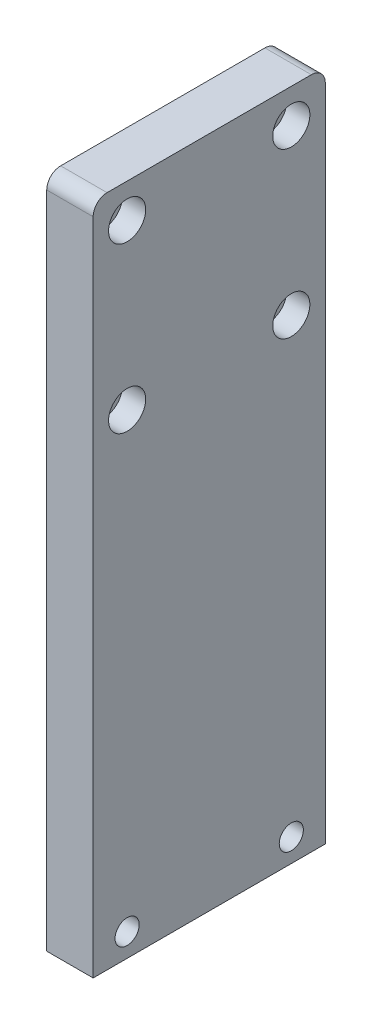
ISO-10303-21;
HEADER;
FILE_DESCRIPTION(('STEP AP214'),'2;1');
FILE_NAME('part.step','',(''),(''),'','','');
FILE_SCHEMA(('AUTOMOTIVE_DESIGN { 1 0 10303 214 1 1 1 1 }'));
ENDSEC;
DATA;
#1=APPLICATION_CONTEXT('core data for automotive mechanical design processes');
#2=APPLICATION_PROTOCOL_DEFINITION('international standard','automotive_design',2000,#1);
#3=PRODUCT_CONTEXT('',#1,'mechanical');
#4=PRODUCT('Part','Part','',(#3));
#5=PRODUCT_RELATED_PRODUCT_CATEGORY('part','',(#4));
#6=PRODUCT_DEFINITION_FORMATION('','',#4);
#7=PRODUCT_DEFINITION_CONTEXT('part definition',#1,'design');
#8=PRODUCT_DEFINITION('design','',#6,#7);
#9=PRODUCT_DEFINITION_SHAPE('','',#8);
#10=(LENGTH_UNIT() NAMED_UNIT(*) SI_UNIT(.MILLI.,.METRE.));
#11=(NAMED_UNIT(*) PLANE_ANGLE_UNIT() SI_UNIT($,.RADIAN.));
#12=(NAMED_UNIT(*) SI_UNIT($,.STERADIAN.) SOLID_ANGLE_UNIT());
#13=UNCERTAINTY_MEASURE_WITH_UNIT(LENGTH_MEASURE(1.E-05),#10,'distance_accuracy_value','');
#14=(GEOMETRIC_REPRESENTATION_CONTEXT(3) GLOBAL_UNCERTAINTY_ASSIGNED_CONTEXT((#13)) GLOBAL_UNIT_ASSIGNED_CONTEXT((#10,
#11,#12)) REPRESENTATION_CONTEXT('',''));
#15=CARTESIAN_POINT('',(0.,0.,0.));
#16=DIRECTION('',(0.,0.,1.));
#17=DIRECTION('',(1.,0.,0.));
#18=AXIS2_PLACEMENT_3D('',#15,#16,#17);
#19=CARTESIAN_POINT('',(10.,-115.,17.68));
#20=DIRECTION('',(-1.,0.,0.));
#21=DIRECTION('',(0.,0.,1.));
#22=AXIS2_PLACEMENT_3D('',#19,#20,#21);
#23=CYLINDRICAL_SURFACE('',#22,2.6);
#24=CARTESIAN_POINT('',(10.,-115.,17.68));
#25=DIRECTION('',(1.,0.,0.));
#26=DIRECTION('',(0.,0.,-1.));
#27=AXIS2_PLACEMENT_3D('',#24,#25,#26);
#28=CIRCLE('',#27,2.6);
#29=CARTESIAN_POINT('',(10.,-115.,15.08));
#30=VERTEX_POINT('',#29);
#31=EDGE_CURVE('E314',#30,#30,#28,.T.);
#32=ORIENTED_EDGE('',*,*,#31,.T.);
#33=EDGE_LOOP('',(#32));
#34=FACE_BOUND('',#33,.T.);
#35=CARTESIAN_POINT('',(5.,-115.,17.68));
#36=DIRECTION('',(-1.,0.,0.));
#37=DIRECTION('',(0.,0.,1.));
#38=AXIS2_PLACEMENT_3D('',#35,#36,#37);
#39=CIRCLE('',#38,2.6);
#40=CARTESIAN_POINT('',(5.,-115.,20.28));
#41=VERTEX_POINT('',#40);
#42=EDGE_CURVE('E51',#41,#41,#39,.T.);
#43=ORIENTED_EDGE('',*,*,#42,.T.);
#44=EDGE_LOOP('',(#43));
#45=FACE_BOUND('',#44,.T.);
#46=ADVANCED_FACE('F47',(#34,#45),#23,.F.);
#47=CARTESIAN_POINT('',(10.,17.68,17.68));
#48=DIRECTION('',(-1.,0.,0.));
#49=DIRECTION('',(0.,0.,1.));
#50=AXIS2_PLACEMENT_3D('',#47,#48,#49);
#51=CYLINDRICAL_SURFACE('',#50,2.6);
#52=CARTESIAN_POINT('',(0.,17.68,17.68));
#53=DIRECTION('',(1.,0.,0.));
#54=DIRECTION('',(0.,0.,-1.));
#55=AXIS2_PLACEMENT_3D('',#52,#53,#54);
#56=CIRCLE('',#55,2.6);
#57=CARTESIAN_POINT('',(0.,17.68,15.08));
#58=VERTEX_POINT('',#57);
#59=EDGE_CURVE('E361',#58,#58,#56,.T.);
#60=ORIENTED_EDGE('',*,*,#59,.F.);
#61=EDGE_LOOP('',(#60));
#62=FACE_BOUND('',#61,.T.);
#63=CARTESIAN_POINT('',(5.,17.68,17.68));
#64=DIRECTION('',(1.,0.,0.));
#65=DIRECTION('',(0.,0.,-1.));
#66=AXIS2_PLACEMENT_3D('',#63,#64,#65);
#67=CIRCLE('',#66,2.6);
#68=CARTESIAN_POINT('',(5.,17.68,15.08));
#69=VERTEX_POINT('',#68);
#70=EDGE_CURVE('E315',#69,#69,#67,.T.);
#71=ORIENTED_EDGE('',*,*,#70,.T.);
#72=EDGE_LOOP('',(#71));
#73=FACE_BOUND('',#72,.T.);
#74=ADVANCED_FACE('F570',(#62,#73),#51,.F.);
#75=CARTESIAN_POINT('',(10.,17.68,-17.68));
#76=DIRECTION('',(-1.,0.,0.));
#77=DIRECTION('',(0.,0.,1.));
#78=AXIS2_PLACEMENT_3D('',#75,#76,#77);
#79=CYLINDRICAL_SURFACE('',#78,2.6);
#80=CARTESIAN_POINT('',(0.,17.68,-17.68));
#81=DIRECTION('',(1.,0.,0.));
#82=DIRECTION('',(0.,0.,1.));
#83=AXIS2_PLACEMENT_3D('',#80,#81,#82);
#84=CIRCLE('',#83,2.6);
#85=CARTESIAN_POINT('',(0.,17.68,-15.08));
#86=VERTEX_POINT('',#85);
#87=EDGE_CURVE('E357',#86,#86,#84,.T.);
#88=ORIENTED_EDGE('',*,*,#87,.F.);
#89=EDGE_LOOP('',(#88));
#90=FACE_BOUND('',#89,.T.);
#91=CARTESIAN_POINT('',(5.,17.68,-17.68));
#92=DIRECTION('',(1.,0.,0.));
#93=DIRECTION('',(0.,0.,-1.));
#94=AXIS2_PLACEMENT_3D('',#91,#92,#93);
#95=CIRCLE('',#94,2.6);
#96=CARTESIAN_POINT('',(5.,17.68,-20.28));
#97=VERTEX_POINT('',#96);
#98=EDGE_CURVE('E377',#97,#97,#95,.T.);
#99=ORIENTED_EDGE('',*,*,#98,.T.);
#100=EDGE_LOOP('',(#99));
#101=FACE_BOUND('',#100,.T.);
#102=ADVANCED_FACE('F576',(#90,#101),#79,.F.);
#103=CARTESIAN_POINT('',(10.,-17.68,-17.68));
#104=DIRECTION('',(-1.,0.,0.));
#105=DIRECTION('',(0.,0.,1.));
#106=AXIS2_PLACEMENT_3D('',#103,#104,#105);
#107=CYLINDRICAL_SURFACE('',#106,2.6);
#108=CARTESIAN_POINT('',(0.,-17.68,-17.68));
#109=DIRECTION('',(1.,0.,0.));
#110=DIRECTION('',(0.,0.,-1.));
#111=AXIS2_PLACEMENT_3D('',#108,#109,#110);
#112=CIRCLE('',#111,2.6);
#113=CARTESIAN_POINT('',(0.,-17.68,-20.28));
#114=VERTEX_POINT('',#113);
#115=EDGE_CURVE('E362',#114,#114,#112,.T.);
#116=ORIENTED_EDGE('',*,*,#115,.F.);
#117=EDGE_LOOP('',(#116));
#118=FACE_BOUND('',#117,.T.);
#119=CARTESIAN_POINT('',(5.,-17.68,-17.68));
#120=DIRECTION('',(1.,0.,0.));
#121=DIRECTION('',(0.,0.,-1.));
#122=AXIS2_PLACEMENT_3D('',#119,#120,#121);
#123=CIRCLE('',#122,2.6);
#124=CARTESIAN_POINT('',(5.,-17.68,-20.28));
#125=VERTEX_POINT('',#124);
#126=EDGE_CURVE('E463',#125,#125,#123,.T.);
#127=ORIENTED_EDGE('',*,*,#126,.T.);
#128=EDGE_LOOP('',(#127));
#129=FACE_BOUND('',#128,.T.);
#130=ADVANCED_FACE('F587',(#118,#129),#107,.F.);
#131=CARTESIAN_POINT('',(10.,-17.68,17.68));
#132=DIRECTION('',(-1.,0.,0.));
#133=DIRECTION('',(0.,0.,1.));
#134=AXIS2_PLACEMENT_3D('',#131,#132,#133);
#135=CYLINDRICAL_SURFACE('',#134,2.6);
#136=CARTESIAN_POINT('',(0.,-17.68,17.68));
#137=DIRECTION('',(1.,0.,0.));
#138=DIRECTION('',(0.,0.,1.));
#139=AXIS2_PLACEMENT_3D('',#136,#137,#138);
#140=CIRCLE('',#139,2.6);
#141=CARTESIAN_POINT('',(0.,-17.68,20.28));
#142=VERTEX_POINT('',#141);
#143=EDGE_CURVE('E322',#142,#142,#140,.T.);
#144=ORIENTED_EDGE('',*,*,#143,.F.);
#145=EDGE_LOOP('',(#144));
#146=FACE_BOUND('',#145,.T.);
#147=CARTESIAN_POINT('',(5.,-17.68,17.68));
#148=DIRECTION('',(1.,0.,0.));
#149=DIRECTION('',(0.,0.,-1.));
#150=AXIS2_PLACEMENT_3D('',#147,#148,#149);
#151=CIRCLE('',#150,2.6);
#152=CARTESIAN_POINT('',(5.,-17.68,15.08));
#153=VERTEX_POINT('',#152);
#154=EDGE_CURVE('E346',#153,#153,#151,.T.);
#155=ORIENTED_EDGE('',*,*,#154,.T.);
#156=EDGE_LOOP('',(#155));
#157=FACE_BOUND('',#156,.T.);
#158=ADVANCED_FACE('F584',(#146,#157),#135,.F.);
#159=CARTESIAN_POINT('',(10.,0.,0.));
#160=DIRECTION('',(1.,0.,0.));
#161=DIRECTION('',(0.,0.,-1.));
#162=AXIS2_PLACEMENT_3D('',#159,#160,#161);
#163=PLANE('',#162);
#164=CARTESIAN_POINT('',(10.,-17.68,-17.68));
#165=DIRECTION('',(1.,0.,0.));
#166=DIRECTION('',(0.,0.,-1.));
#167=AXIS2_PLACEMENT_3D('',#164,#165,#166);
#168=CIRCLE('',#167,4.);
#169=CARTESIAN_POINT('',(10.,-17.68,-21.68));
#170=VERTEX_POINT('',#169);
#171=EDGE_CURVE('E338',#170,#170,#168,.T.);
#172=ORIENTED_EDGE('',*,*,#171,.F.);
#173=EDGE_LOOP('',(#172));
#174=FACE_BOUND('',#173,.T.);
#175=CARTESIAN_POINT('',(10.,-17.68,17.68));
#176=DIRECTION('',(1.,0.,0.));
#177=DIRECTION('',(0.,0.,-1.));
#178=AXIS2_PLACEMENT_3D('',#175,#176,#177);
#179=CIRCLE('',#178,4.);
#180=CARTESIAN_POINT('',(10.,-17.68,13.68));
#181=VERTEX_POINT('',#180);
#182=EDGE_CURVE('E337',#181,#181,#179,.T.);
#183=ORIENTED_EDGE('',*,*,#182,.F.);
#184=EDGE_LOOP('',(#183));
#185=FACE_BOUND('',#184,.T.);
#186=CARTESIAN_POINT('',(10.,17.68,17.68));
#187=DIRECTION('',(1.,0.,0.));
#188=DIRECTION('',(0.,0.,-1.));
#189=AXIS2_PLACEMENT_3D('',#186,#187,#188);
#190=CIRCLE('',#189,4.);
#191=CARTESIAN_POINT('',(10.,17.68,13.68));
#192=VERTEX_POINT('',#191);
#193=EDGE_CURVE('E472',#192,#192,#190,.T.);
#194=ORIENTED_EDGE('',*,*,#193,.F.);
#195=EDGE_LOOP('',(#194));
#196=FACE_BOUND('',#195,.T.);
#197=CARTESIAN_POINT('',(10.,17.68,-17.68));
#198=DIRECTION('',(1.,0.,0.));
#199=DIRECTION('',(0.,0.,-1.));
#200=AXIS2_PLACEMENT_3D('',#197,#198,#199);
#201=CIRCLE('',#200,4.);
#202=CARTESIAN_POINT('',(10.,17.68,-21.68));
#203=VERTEX_POINT('',#202);
#204=EDGE_CURVE('E316',#203,#203,#201,.T.);
#205=ORIENTED_EDGE('',*,*,#204,.F.);
#206=EDGE_LOOP('',(#205));
#207=FACE_BOUND('',#206,.T.);
#208=ORIENTED_EDGE('',*,*,#31,.F.);
#209=EDGE_LOOP('',(#208));
#210=FACE_BOUND('',#209,.T.);
#211=DIRECTION('',(0.,1.,0.));
#212=VECTOR('',#211,1.);
#213=CARTESIAN_POINT('',(10.,-120.,-25.));
#214=LINE('',#213,#212);
#215=CARTESIAN_POINT('',(10.,-120.,-25.));
#216=VERTEX_POINT('',#215);
#217=CARTESIAN_POINT('',(10.,22.,-25.));
#218=VERTEX_POINT('',#217);
#219=EDGE_CURVE('E131',#216,#218,#214,.T.);
#220=ORIENTED_EDGE('',*,*,#219,.T.);
#221=CARTESIAN_POINT('',(10.,22.,-22.));
#222=DIRECTION('',(1.,0.,0.));
#223=DIRECTION('',(0.,0.,-1.));
#224=AXIS2_PLACEMENT_3D('',#221,#222,#223);
#225=CIRCLE('',#224,3.);
#226=CARTESIAN_POINT('',(10.,25.,-22.));
#227=VERTEX_POINT('',#226);
#228=EDGE_CURVE('E57',#218,#227,#225,.T.);
#229=ORIENTED_EDGE('',*,*,#228,.T.);
#230=DIRECTION('',(0.,0.,1.));
#231=VECTOR('',#230,1.);
#232=CARTESIAN_POINT('',(10.,25.,25.));
#233=LINE('',#232,#231);
#234=CARTESIAN_POINT('',(10.,25.,22.));
#235=VERTEX_POINT('',#234);
#236=EDGE_CURVE('E116',#227,#235,#233,.T.);
#237=ORIENTED_EDGE('',*,*,#236,.T.);
#238=CARTESIAN_POINT('',(10.,22.,22.));
#239=DIRECTION('',(1.,0.,0.));
#240=DIRECTION('',(0.,0.,-1.));
#241=AXIS2_PLACEMENT_3D('',#238,#239,#240);
#242=CIRCLE('',#241,3.);
#243=CARTESIAN_POINT('',(10.,22.,25.));
#244=VERTEX_POINT('',#243);
#245=EDGE_CURVE('E65',#235,#244,#242,.T.);
#246=ORIENTED_EDGE('',*,*,#245,.T.);
#247=DIRECTION('',(0.,-1.,0.));
#248=VECTOR('',#247,1.);
#249=CARTESIAN_POINT('',(10.,0.,25.));
#250=LINE('',#249,#248);
#251=CARTESIAN_POINT('',(10.,-120.,25.));
#252=VERTEX_POINT('',#251);
#253=EDGE_CURVE('E106',#244,#252,#250,.T.);
#254=ORIENTED_EDGE('',*,*,#253,.T.);
#255=DIRECTION('',(0.,0.,-1.));
#256=VECTOR('',#255,1.);
#257=CARTESIAN_POINT('',(10.,-120.,25.));
#258=LINE('',#257,#256);
#259=EDGE_CURVE('E111',#252,#216,#258,.T.);
#260=ORIENTED_EDGE('',*,*,#259,.T.);
#261=EDGE_LOOP('',(#220,#229,#237,#246,#254,#260));
#262=FACE_BOUND('',#261,.T.);
#263=CARTESIAN_POINT('',(10.,-115.,-17.68));
#264=DIRECTION('',(1.,0.,0.));
#265=DIRECTION('',(0.,0.,1.));
#266=AXIS2_PLACEMENT_3D('',#263,#264,#265);
#267=CIRCLE('',#266,2.6);
#268=CARTESIAN_POINT('',(10.,-115.,-15.08));
#269=VERTEX_POINT('',#268);
#270=EDGE_CURVE('E309',#269,#269,#267,.T.);
#271=ORIENTED_EDGE('',*,*,#270,.F.);
#272=EDGE_LOOP('',(#271));
#273=FACE_BOUND('',#272,.T.);
#274=ADVANCED_FACE('F108',(#174,#185,#196,#207,#210,#262,#273),#163,.T.);
#275=CARTESIAN_POINT('',(0.,0.,0.));
#276=DIRECTION('',(1.,0.,0.));
#277=DIRECTION('',(0.,0.,-1.));
#278=AXIS2_PLACEMENT_3D('',#275,#276,#277);
#279=PLANE('',#278);
#280=CARTESIAN_POINT('',(0.,-115.,17.68));
#281=DIRECTION('',(-1.,0.,0.));
#282=DIRECTION('',(0.,0.,1.));
#283=AXIS2_PLACEMENT_3D('',#280,#281,#282);
#284=CIRCLE('',#283,4.);
#285=CARTESIAN_POINT('',(0.,-115.,21.68));
#286=VERTEX_POINT('',#285);
#287=EDGE_CURVE('E486',#286,#286,#284,.T.);
#288=ORIENTED_EDGE('',*,*,#287,.F.);
#289=EDGE_LOOP('',(#288));
#290=FACE_BOUND('',#289,.T.);
#291=CARTESIAN_POINT('',(0.,-115.,-17.68));
#292=DIRECTION('',(-1.,0.,0.));
#293=DIRECTION('',(0.,0.,-1.));
#294=AXIS2_PLACEMENT_3D('',#291,#292,#293);
#295=CIRCLE('',#294,4.);
#296=CARTESIAN_POINT('',(0.,-115.,-21.68));
#297=VERTEX_POINT('',#296);
#298=EDGE_CURVE('E479',#297,#297,#295,.T.);
#299=ORIENTED_EDGE('',*,*,#298,.F.);
#300=EDGE_LOOP('',(#299));
#301=FACE_BOUND('',#300,.T.);
#302=DIRECTION('',(0.,0.,1.));
#303=VECTOR('',#302,1.);
#304=CARTESIAN_POINT('',(0.,25.,0.));
#305=LINE('',#304,#303);
#306=CARTESIAN_POINT('',(0.,25.,-22.));
#307=VERTEX_POINT('',#306);
#308=CARTESIAN_POINT('',(0.,25.,22.));
#309=VERTEX_POINT('',#308);
#310=EDGE_CURVE('E394',#307,#309,#305,.T.);
#311=ORIENTED_EDGE('',*,*,#310,.F.);
#312=CARTESIAN_POINT('',(0.,22.,-22.));
#313=DIRECTION('',(1.,0.,0.));
#314=DIRECTION('',(0.,0.,-1.));
#315=AXIS2_PLACEMENT_3D('',#312,#313,#314);
#316=CIRCLE('',#315,3.);
#317=CARTESIAN_POINT('',(0.,22.,-25.));
#318=VERTEX_POINT('',#317);
#319=EDGE_CURVE('E386',#307,#318,#316,.F.);
#320=ORIENTED_EDGE('',*,*,#319,.T.);
#321=DIRECTION('',(0.,1.,0.));
#322=VECTOR('',#321,1.);
#323=CARTESIAN_POINT('',(0.,-120.,-25.));
#324=LINE('',#323,#322);
#325=CARTESIAN_POINT('',(0.,-120.,-25.));
#326=VERTEX_POINT('',#325);
#327=EDGE_CURVE('E392',#326,#318,#324,.T.);
#328=ORIENTED_EDGE('',*,*,#327,.F.);
#329=DIRECTION('',(0.,0.,-1.));
#330=VECTOR('',#329,1.);
#331=CARTESIAN_POINT('',(0.,-120.,25.));
#332=LINE('',#331,#330);
#333=CARTESIAN_POINT('',(0.,-120.,25.));
#334=VERTEX_POINT('',#333);
#335=EDGE_CURVE('E398',#334,#326,#332,.T.);
#336=ORIENTED_EDGE('',*,*,#335,.F.);
#337=DIRECTION('',(0.,-1.,0.));
#338=VECTOR('',#337,1.);
#339=CARTESIAN_POINT('',(0.,0.,25.));
#340=LINE('',#339,#338);
#341=CARTESIAN_POINT('',(0.,22.,25.));
#342=VERTEX_POINT('',#341);
#343=EDGE_CURVE('E122',#342,#334,#340,.T.);
#344=ORIENTED_EDGE('',*,*,#343,.F.);
#345=CARTESIAN_POINT('',(0.,22.,22.));
#346=DIRECTION('',(1.,0.,0.));
#347=DIRECTION('',(0.,0.,-1.));
#348=AXIS2_PLACEMENT_3D('',#345,#346,#347);
#349=CIRCLE('',#348,3.);
#350=EDGE_CURVE('E384',#342,#309,#349,.F.);
#351=ORIENTED_EDGE('',*,*,#350,.T.);
#352=EDGE_LOOP('',(#311,#320,#328,#336,#344,#351));
#353=FACE_BOUND('',#352,.T.);
#354=ORIENTED_EDGE('',*,*,#59,.T.);
#355=EDGE_LOOP('',(#354));
#356=FACE_BOUND('',#355,.T.);
#357=ORIENTED_EDGE('',*,*,#87,.T.);
#358=EDGE_LOOP('',(#357));
#359=FACE_BOUND('',#358,.T.);
#360=ORIENTED_EDGE('',*,*,#115,.T.);
#361=EDGE_LOOP('',(#360));
#362=FACE_BOUND('',#361,.T.);
#363=ORIENTED_EDGE('',*,*,#143,.T.);
#364=EDGE_LOOP('',(#363));
#365=FACE_BOUND('',#364,.T.);
#366=ADVANCED_FACE('F390',(#290,#301,#353,#356,#359,#362,#365),#279,.F.);
#367=CARTESIAN_POINT('',(10.,0.,25.));
#368=DIRECTION('',(0.,0.,-1.));
#369=DIRECTION('',(0.,1.,0.));
#370=AXIS2_PLACEMENT_3D('',#367,#368,#369);
#371=PLANE('',#370);
#372=ORIENTED_EDGE('',*,*,#253,.F.);
#373=DIRECTION('',(-1.,0.,0.));
#374=VECTOR('',#373,1.);
#375=CARTESIAN_POINT('',(10.,22.,25.));
#376=LINE('',#375,#374);
#377=EDGE_CURVE('E12',#244,#342,#376,.T.);
#378=ORIENTED_EDGE('',*,*,#377,.T.);
#379=ORIENTED_EDGE('',*,*,#343,.T.);
#380=DIRECTION('',(-1.,0.,0.));
#381=VECTOR('',#380,1.);
#382=CARTESIAN_POINT('',(10.,-120.,25.));
#383=LINE('',#382,#381);
#384=EDGE_CURVE('E119',#252,#334,#383,.T.);
#385=ORIENTED_EDGE('',*,*,#384,.F.);
#386=EDGE_LOOP('',(#372,#378,#379,#385));
#387=FACE_BOUND('',#386,.T.);
#388=ADVANCED_FACE('F120',(#387),#371,.F.);
#389=CARTESIAN_POINT('',(10.,-120.,25.));
#390=DIRECTION('',(0.,1.,0.));
#391=DIRECTION('',(0.,0.,1.));
#392=AXIS2_PLACEMENT_3D('',#389,#390,#391);
#393=PLANE('',#392);
#394=ORIENTED_EDGE('',*,*,#335,.T.);
#395=DIRECTION('',(-1.,0.,0.));
#396=VECTOR('',#395,1.);
#397=CARTESIAN_POINT('',(10.,-120.,-25.));
#398=LINE('',#397,#396);
#399=EDGE_CURVE('E126',#216,#326,#398,.T.);
#400=ORIENTED_EDGE('',*,*,#399,.F.);
#401=ORIENTED_EDGE('',*,*,#259,.F.);
#402=ORIENTED_EDGE('',*,*,#384,.T.);
#403=EDGE_LOOP('',(#394,#400,#401,#402));
#404=FACE_BOUND('',#403,.T.);
#405=ADVANCED_FACE('F128',(#404),#393,.F.);
#406=CARTESIAN_POINT('',(10.,-120.,-25.));
#407=DIRECTION('',(0.,0.,1.));
#408=DIRECTION('',(0.,-1.,0.));
#409=AXIS2_PLACEMENT_3D('',#406,#407,#408);
#410=PLANE('',#409);
#411=ORIENTED_EDGE('',*,*,#327,.T.);
#412=DIRECTION('',(-1.,0.,0.));
#413=VECTOR('',#412,1.);
#414=CARTESIAN_POINT('',(10.,22.,-25.));
#415=LINE('',#414,#413);
#416=EDGE_CURVE('E73',#318,#218,#415,.F.);
#417=ORIENTED_EDGE('',*,*,#416,.T.);
#418=ORIENTED_EDGE('',*,*,#219,.F.);
#419=ORIENTED_EDGE('',*,*,#399,.T.);
#420=EDGE_LOOP('',(#411,#417,#418,#419));
#421=FACE_BOUND('',#420,.T.);
#422=ADVANCED_FACE('F397',(#421),#410,.F.);
#423=CARTESIAN_POINT('',(10.,25.,0.));
#424=DIRECTION('',(0.,-1.,0.));
#425=DIRECTION('',(0.,0.,-1.));
#426=AXIS2_PLACEMENT_3D('',#423,#424,#425);
#427=PLANE('',#426);
#428=ORIENTED_EDGE('',*,*,#236,.F.);
#429=DIRECTION('',(-1.,0.,0.));
#430=VECTOR('',#429,1.);
#431=CARTESIAN_POINT('',(10.,25.,-22.));
#432=LINE('',#431,#430);
#433=EDGE_CURVE('E381',#227,#307,#432,.T.);
#434=ORIENTED_EDGE('',*,*,#433,.T.);
#435=ORIENTED_EDGE('',*,*,#310,.T.);
#436=DIRECTION('',(-1.,0.,0.));
#437=VECTOR('',#436,1.);
#438=CARTESIAN_POINT('',(10.,25.,22.));
#439=LINE('',#438,#437);
#440=EDGE_CURVE('E125',#309,#235,#439,.F.);
#441=ORIENTED_EDGE('',*,*,#440,.T.);
#442=EDGE_LOOP('',(#428,#434,#435,#441));
#443=FACE_BOUND('',#442,.T.);
#444=ADVANCED_FACE('F404',(#443),#427,.F.);
#445=CARTESIAN_POINT('',(10.,-115.,-17.68));
#446=DIRECTION('',(-1.,0.,0.));
#447=DIRECTION('',(0.,0.,1.));
#448=AXIS2_PLACEMENT_3D('',#445,#446,#447);
#449=CYLINDRICAL_SURFACE('',#448,2.6);
#450=CARTESIAN_POINT('',(5.,-115.,-17.68));
#451=DIRECTION('',(1.,0.,0.));
#452=DIRECTION('',(0.,0.,-1.));
#453=AXIS2_PLACEMENT_3D('',#450,#451,#452);
#454=CIRCLE('',#453,2.6);
#455=CARTESIAN_POINT('',(5.,-115.,-20.28));
#456=VERTEX_POINT('',#455);
#457=EDGE_CURVE('E296',#456,#456,#454,.T.);
#458=ORIENTED_EDGE('',*,*,#457,.F.);
#459=EDGE_LOOP('',(#458));
#460=FACE_BOUND('',#459,.T.);
#461=ORIENTED_EDGE('',*,*,#270,.T.);
#462=EDGE_LOOP('',(#461));
#463=FACE_BOUND('',#462,.T.);
#464=ADVANCED_FACE('F582',(#460,#463),#449,.F.);
#465=CARTESIAN_POINT('',(5.,-17.68,17.68));
#466=DIRECTION('',(1.,0.,0.));
#467=DIRECTION('',(0.,0.,-1.));
#468=AXIS2_PLACEMENT_3D('',#465,#466,#467);
#469=CYLINDRICAL_SURFACE('',#468,4.);
#470=CARTESIAN_POINT('',(5.,-17.68,17.68));
#471=DIRECTION('',(1.,0.,0.));
#472=DIRECTION('',(0.,0.,-1.));
#473=AXIS2_PLACEMENT_3D('',#470,#471,#472);
#474=CIRCLE('',#473,4.);
#475=CARTESIAN_POINT('',(5.,-17.68,13.68));
#476=VERTEX_POINT('',#475);
#477=EDGE_CURVE('E469',#476,#476,#474,.T.);
#478=ORIENTED_EDGE('',*,*,#477,.F.);
#479=EDGE_LOOP('',(#478));
#480=FACE_BOUND('',#479,.T.);
#481=ORIENTED_EDGE('',*,*,#182,.T.);
#482=EDGE_LOOP('',(#481));
#483=FACE_BOUND('',#482,.T.);
#484=ADVANCED_FACE('F624',(#480,#483),#469,.F.);
#485=CARTESIAN_POINT('',(5.,-17.68,17.68));
#486=DIRECTION('',(1.,0.,0.));
#487=DIRECTION('',(0.,0.,-1.));
#488=AXIS2_PLACEMENT_3D('',#485,#486,#487);
#489=PLANE('',#488);
#490=ORIENTED_EDGE('',*,*,#154,.F.);
#491=EDGE_LOOP('',(#490));
#492=FACE_BOUND('',#491,.T.);
#493=ORIENTED_EDGE('',*,*,#477,.T.);
#494=EDGE_LOOP('',(#493));
#495=FACE_BOUND('',#494,.T.);
#496=ADVANCED_FACE('F620',(#492,#495),#489,.T.);
#497=CARTESIAN_POINT('',(5.,-17.68,-17.68));
#498=DIRECTION('',(1.,0.,0.));
#499=DIRECTION('',(0.,0.,-1.));
#500=AXIS2_PLACEMENT_3D('',#497,#498,#499);
#501=CYLINDRICAL_SURFACE('',#500,4.);
#502=CARTESIAN_POINT('',(5.,-17.68,-17.68));
#503=DIRECTION('',(1.,0.,0.));
#504=DIRECTION('',(0.,0.,-1.));
#505=AXIS2_PLACEMENT_3D('',#502,#503,#504);
#506=CIRCLE('',#505,4.);
#507=CARTESIAN_POINT('',(5.,-17.68,-21.68));
#508=VERTEX_POINT('',#507);
#509=EDGE_CURVE('E333',#508,#508,#506,.T.);
#510=ORIENTED_EDGE('',*,*,#509,.F.);
#511=EDGE_LOOP('',(#510));
#512=FACE_BOUND('',#511,.T.);
#513=ORIENTED_EDGE('',*,*,#171,.T.);
#514=EDGE_LOOP('',(#513));
#515=FACE_BOUND('',#514,.T.);
#516=ADVANCED_FACE('F623',(#512,#515),#501,.F.);
#517=CARTESIAN_POINT('',(5.,-17.68,-17.68));
#518=DIRECTION('',(1.,0.,0.));
#519=DIRECTION('',(0.,0.,-1.));
#520=AXIS2_PLACEMENT_3D('',#517,#518,#519);
#521=PLANE('',#520);
#522=ORIENTED_EDGE('',*,*,#126,.F.);
#523=EDGE_LOOP('',(#522));
#524=FACE_BOUND('',#523,.T.);
#525=ORIENTED_EDGE('',*,*,#509,.T.);
#526=EDGE_LOOP('',(#525));
#527=FACE_BOUND('',#526,.T.);
#528=ADVANCED_FACE('F629',(#524,#527),#521,.T.);
#529=CARTESIAN_POINT('',(5.,17.68,-17.68));
#530=DIRECTION('',(1.,0.,0.));
#531=DIRECTION('',(0.,0.,-1.));
#532=AXIS2_PLACEMENT_3D('',#529,#530,#531);
#533=CYLINDRICAL_SURFACE('',#532,4.);
#534=CARTESIAN_POINT('',(5.,17.68,-17.68));
#535=DIRECTION('',(1.,0.,0.));
#536=DIRECTION('',(0.,0.,-1.));
#537=AXIS2_PLACEMENT_3D('',#534,#535,#536);
#538=CIRCLE('',#537,4.);
#539=CARTESIAN_POINT('',(5.,17.68,-21.68));
#540=VERTEX_POINT('',#539);
#541=EDGE_CURVE('E343',#540,#540,#538,.T.);
#542=ORIENTED_EDGE('',*,*,#541,.F.);
#543=EDGE_LOOP('',(#542));
#544=FACE_BOUND('',#543,.T.);
#545=ORIENTED_EDGE('',*,*,#204,.T.);
#546=EDGE_LOOP('',(#545));
#547=FACE_BOUND('',#546,.T.);
#548=ADVANCED_FACE('F632',(#544,#547),#533,.F.);
#549=CARTESIAN_POINT('',(5.,17.68,-17.68));
#550=DIRECTION('',(1.,0.,0.));
#551=DIRECTION('',(0.,0.,-1.));
#552=AXIS2_PLACEMENT_3D('',#549,#550,#551);
#553=PLANE('',#552);
#554=ORIENTED_EDGE('',*,*,#98,.F.);
#555=EDGE_LOOP('',(#554));
#556=FACE_BOUND('',#555,.T.);
#557=ORIENTED_EDGE('',*,*,#541,.T.);
#558=EDGE_LOOP('',(#557));
#559=FACE_BOUND('',#558,.T.);
#560=ADVANCED_FACE('F614',(#556,#559),#553,.T.);
#561=CARTESIAN_POINT('',(5.,17.68,17.68));
#562=DIRECTION('',(1.,0.,0.));
#563=DIRECTION('',(0.,0.,-1.));
#564=AXIS2_PLACEMENT_3D('',#561,#562,#563);
#565=CYLINDRICAL_SURFACE('',#564,4.);
#566=CARTESIAN_POINT('',(5.,17.68,17.68));
#567=DIRECTION('',(1.,0.,0.));
#568=DIRECTION('',(0.,0.,-1.));
#569=AXIS2_PLACEMENT_3D('',#566,#567,#568);
#570=CIRCLE('',#569,4.);
#571=CARTESIAN_POINT('',(5.,17.68,13.68));
#572=VERTEX_POINT('',#571);
#573=EDGE_CURVE('E476',#572,#572,#570,.T.);
#574=ORIENTED_EDGE('',*,*,#573,.F.);
#575=EDGE_LOOP('',(#574));
#576=FACE_BOUND('',#575,.T.);
#577=ORIENTED_EDGE('',*,*,#193,.T.);
#578=EDGE_LOOP('',(#577));
#579=FACE_BOUND('',#578,.T.);
#580=ADVANCED_FACE('F610',(#576,#579),#565,.F.);
#581=CARTESIAN_POINT('',(5.,17.68,17.68));
#582=DIRECTION('',(1.,0.,0.));
#583=DIRECTION('',(0.,0.,-1.));
#584=AXIS2_PLACEMENT_3D('',#581,#582,#583);
#585=PLANE('',#584);
#586=ORIENTED_EDGE('',*,*,#70,.F.);
#587=EDGE_LOOP('',(#586));
#588=FACE_BOUND('',#587,.T.);
#589=ORIENTED_EDGE('',*,*,#573,.T.);
#590=EDGE_LOOP('',(#589));
#591=FACE_BOUND('',#590,.T.);
#592=ADVANCED_FACE('F606',(#588,#591),#585,.T.);
#593=CARTESIAN_POINT('',(10.,22.,-22.));
#594=DIRECTION('',(-1.,0.,0.));
#595=DIRECTION('',(0.,0.,1.));
#596=AXIS2_PLACEMENT_3D('',#593,#594,#595);
#597=CYLINDRICAL_SURFACE('',#596,3.);
#598=ORIENTED_EDGE('',*,*,#228,.F.);
#599=ORIENTED_EDGE('',*,*,#416,.F.);
#600=ORIENTED_EDGE('',*,*,#319,.F.);
#601=ORIENTED_EDGE('',*,*,#433,.F.);
#602=EDGE_LOOP('',(#598,#599,#600,#601));
#603=FACE_BOUND('',#602,.T.);
#604=ADVANCED_FACE('F401',(#603),#597,.T.);
#605=CARTESIAN_POINT('',(10.,22.,22.));
#606=DIRECTION('',(-1.,0.,0.));
#607=DIRECTION('',(0.,0.,1.));
#608=AXIS2_PLACEMENT_3D('',#605,#606,#607);
#609=CYLINDRICAL_SURFACE('',#608,3.);
#610=ORIENTED_EDGE('',*,*,#245,.F.);
#611=ORIENTED_EDGE('',*,*,#440,.F.);
#612=ORIENTED_EDGE('',*,*,#350,.F.);
#613=ORIENTED_EDGE('',*,*,#377,.F.);
#614=EDGE_LOOP('',(#610,#611,#612,#613));
#615=FACE_BOUND('',#614,.T.);
#616=ADVANCED_FACE('F49',(#615),#609,.T.);
#617=CARTESIAN_POINT('',(5.,-115.,-17.68));
#618=DIRECTION('',(-1.,0.,0.));
#619=DIRECTION('',(0.,0.,1.));
#620=AXIS2_PLACEMENT_3D('',#617,#618,#619);
#621=CYLINDRICAL_SURFACE('',#620,4.);
#622=CARTESIAN_POINT('',(5.,-115.,-17.68));
#623=DIRECTION('',(-1.,0.,0.));
#624=DIRECTION('',(0.,0.,-1.));
#625=AXIS2_PLACEMENT_3D('',#622,#623,#624);
#626=CIRCLE('',#625,4.);
#627=CARTESIAN_POINT('',(5.,-115.,-21.68));
#628=VERTEX_POINT('',#627);
#629=EDGE_CURVE('E483',#628,#628,#626,.T.);
#630=ORIENTED_EDGE('',*,*,#629,.F.);
#631=EDGE_LOOP('',(#630));
#632=FACE_BOUND('',#631,.T.);
#633=ORIENTED_EDGE('',*,*,#298,.T.);
#634=EDGE_LOOP('',(#633));
#635=FACE_BOUND('',#634,.T.);
#636=ADVANCED_FACE('F556',(#632,#635),#621,.F.);
#637=CARTESIAN_POINT('',(5.,-115.,-17.68));
#638=DIRECTION('',(1.,0.,0.));
#639=DIRECTION('',(0.,0.,-1.));
#640=AXIS2_PLACEMENT_3D('',#637,#638,#639);
#641=PLANE('',#640);
#642=ORIENTED_EDGE('',*,*,#457,.T.);
#643=EDGE_LOOP('',(#642));
#644=FACE_BOUND('',#643,.T.);
#645=ORIENTED_EDGE('',*,*,#629,.T.);
#646=EDGE_LOOP('',(#645));
#647=FACE_BOUND('',#646,.T.);
#648=ADVANCED_FACE('F547',(#644,#647),#641,.F.);
#649=CARTESIAN_POINT('',(5.,-115.,17.68));
#650=DIRECTION('',(-1.,0.,0.));
#651=DIRECTION('',(0.,0.,1.));
#652=AXIS2_PLACEMENT_3D('',#649,#650,#651);
#653=CYLINDRICAL_SURFACE('',#652,4.);
#654=CARTESIAN_POINT('',(5.,-115.,17.68));
#655=DIRECTION('',(-1.,0.,0.));
#656=DIRECTION('',(0.,0.,1.));
#657=AXIS2_PLACEMENT_3D('',#654,#655,#656);
#658=CIRCLE('',#657,4.);
#659=CARTESIAN_POINT('',(5.,-115.,21.68));
#660=VERTEX_POINT('',#659);
#661=EDGE_CURVE('E299',#660,#660,#658,.T.);
#662=ORIENTED_EDGE('',*,*,#661,.F.);
#663=EDGE_LOOP('',(#662));
#664=FACE_BOUND('',#663,.T.);
#665=ORIENTED_EDGE('',*,*,#287,.T.);
#666=EDGE_LOOP('',(#665));
#667=FACE_BOUND('',#666,.T.);
#668=ADVANCED_FACE('F544',(#664,#667),#653,.F.);
#669=CARTESIAN_POINT('',(5.,-115.,17.68));
#670=DIRECTION('',(-1.,0.,0.));
#671=DIRECTION('',(0.,0.,1.));
#672=AXIS2_PLACEMENT_3D('',#669,#670,#671);
#673=PLANE('',#672);
#674=ORIENTED_EDGE('',*,*,#42,.F.);
#675=EDGE_LOOP('',(#674));
#676=FACE_BOUND('',#675,.T.);
#677=ORIENTED_EDGE('',*,*,#661,.T.);
#678=EDGE_LOOP('',(#677));
#679=FACE_BOUND('',#678,.T.);
#680=ADVANCED_FACE('F542',(#676,#679),#673,.T.);
#681=CLOSED_SHELL('',(#46,#74,#102,#130,#158,#274,#366,#388,#405,#422,#444,#464,#484,#496,#516,
#528,#548,#560,#580,#592,#604,#616,#636,#648,#668,#680));
#682=MANIFOLD_SOLID_BREP('B2',#681);
#683=ADVANCED_BREP_SHAPE_REPRESENTATION('',(#18,#682),#14);
#684=SHAPE_DEFINITION_REPRESENTATION(#9,#683);
ENDSEC;
END-ISO-10303-21;
